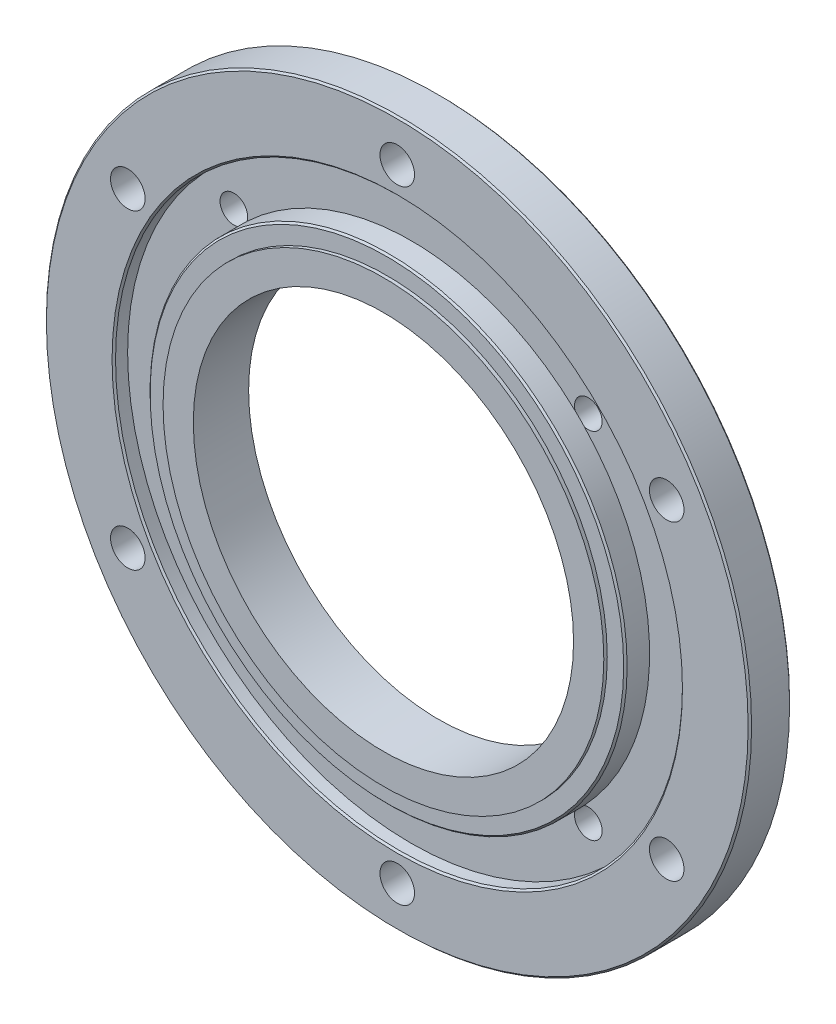
ISO-10303-21;
HEADER;
FILE_DESCRIPTION(('STEP AP214'),'2;1');
FILE_NAME('part.step','',(''),(''),'','','');
FILE_SCHEMA(('AUTOMOTIVE_DESIGN { 1 0 10303 214 1 1 1 1 }'));
ENDSEC;
DATA;
#1=APPLICATION_CONTEXT('core data for automotive mechanical design processes');
#2=APPLICATION_PROTOCOL_DEFINITION('international standard','automotive_design',2000,#1);
#3=PRODUCT_CONTEXT('',#1,'mechanical');
#4=PRODUCT('Part','Part','',(#3));
#5=PRODUCT_RELATED_PRODUCT_CATEGORY('part','',(#4));
#6=PRODUCT_DEFINITION_FORMATION('','',#4);
#7=PRODUCT_DEFINITION_CONTEXT('part definition',#1,'design');
#8=PRODUCT_DEFINITION('design','',#6,#7);
#9=PRODUCT_DEFINITION_SHAPE('','',#8);
#10=(LENGTH_UNIT() NAMED_UNIT(*) SI_UNIT(.MILLI.,.METRE.));
#11=(NAMED_UNIT(*) PLANE_ANGLE_UNIT() SI_UNIT($,.RADIAN.));
#12=(NAMED_UNIT(*) SI_UNIT($,.STERADIAN.) SOLID_ANGLE_UNIT());
#13=UNCERTAINTY_MEASURE_WITH_UNIT(LENGTH_MEASURE(1.E-05),#10,'distance_accuracy_value','');
#14=(GEOMETRIC_REPRESENTATION_CONTEXT(3) GLOBAL_UNCERTAINTY_ASSIGNED_CONTEXT((#13)) GLOBAL_UNIT_ASSIGNED_CONTEXT((#10,
#11,#12)) REPRESENTATION_CONTEXT('',''));
#15=CARTESIAN_POINT('',(0.,0.,0.));
#16=DIRECTION('',(0.,0.,1.));
#17=DIRECTION('',(1.,0.,0.));
#18=AXIS2_PLACEMENT_3D('',#15,#16,#17);
#19=CARTESIAN_POINT('',(0.,0.,7.99999999999995));
#20=DIRECTION('',(0.,0.,1.));
#21=DIRECTION('',(1.,0.,0.));
#22=AXIS2_PLACEMENT_3D('',#19,#20,#21);
#23=PLANE('',#22);
#24=CARTESIAN_POINT('',(51.2652416360242,51.265241636023,8.00000000000006));
#25=DIRECTION('',(0.,0.,-1.));
#26=DIRECTION('',(-1.,0.,0.));
#27=AXIS2_PLACEMENT_3D('',#24,#25,#26);
#28=CIRCLE('',#27,4.00000000000171);
#29=CARTESIAN_POINT('',(47.4363605014642,50.1078008135977,8.0000000000004));
#30=VERTEX_POINT('',#29);
#31=CARTESIAN_POINT('',(50.1078008135984,47.4363605014619,7.99999999999998));
#32=VERTEX_POINT('',#31);
#33=EDGE_CURVE('E87',#30,#32,#28,.T.);
#34=ORIENTED_EDGE('',*,*,#33,.T.);
#35=CARTESIAN_POINT('',(0.,0.,7.99999999999995));
#36=DIRECTION('',(0.,0.,1.));
#37=DIRECTION('',(1.,0.,0.));
#38=AXIS2_PLACEMENT_3D('',#35,#36,#37);
#39=CIRCLE('',#38,69.);
#40=CARTESIAN_POINT('',(50.1078008135947,-47.4363605014665,8.00000000000015));
#41=VERTEX_POINT('',#40);
#42=EDGE_CURVE('E80',#41,#32,#39,.T.);
#43=ORIENTED_EDGE('',*,*,#42,.F.);
#44=CARTESIAN_POINT('',(51.265241636023,-51.2652416360264,8.00000000000042));
#45=DIRECTION('',(0.,0.,-1.));
#46=DIRECTION('',(-1.,0.,0.));
#47=AXIS2_PLACEMENT_3D('',#44,#45,#46);
#48=CIRCLE('',#47,4.00000000000117);
#49=CARTESIAN_POINT('',(47.4363605014638,-50.1078008135977,8.00000000000017));
#50=VERTEX_POINT('',#49);
#51=EDGE_CURVE('E252',#41,#50,#48,.T.);
#52=ORIENTED_EDGE('',*,*,#51,.T.);
#53=CARTESIAN_POINT('',(-47.4363605014694,-50.1078008135922,8.00000000000009));
#54=VERTEX_POINT('',#53);
#55=EDGE_CURVE('E102',#54,#50,#39,.T.);
#56=ORIENTED_EDGE('',*,*,#55,.F.);
#57=CARTESIAN_POINT('',(-51.265241636027,-51.2652416360243,7.99999999999998));
#58=DIRECTION('',(0.,0.,-1.));
#59=DIRECTION('',(-1.,0.,0.));
#60=AXIS2_PLACEMENT_3D('',#57,#58,#59);
#61=CIRCLE('',#60,3.99999999999969);
#62=CARTESIAN_POINT('',(-50.1078008135937,-47.4363605014679,8.00000000000009));
#63=VERTEX_POINT('',#62);
#64=EDGE_CURVE('E248',#54,#63,#61,.T.);
#65=ORIENTED_EDGE('',*,*,#64,.T.);
#66=CARTESIAN_POINT('',(-50.1078008135942,47.4363605014672,8.00000000000009));
#67=VERTEX_POINT('',#66);
#68=EDGE_CURVE('E107',#67,#63,#39,.T.);
#69=ORIENTED_EDGE('',*,*,#68,.F.);
#70=CARTESIAN_POINT('',(-51.2652416360244,51.2652416360249,8.00000000000023));
#71=DIRECTION('',(0.,0.,-1.));
#72=DIRECTION('',(-1.,0.,0.));
#73=AXIS2_PLACEMENT_3D('',#70,#71,#72);
#74=CIRCLE('',#73,4.);
#75=CARTESIAN_POINT('',(-47.4363605014667,50.1078008135947,8.0000000000002));
#76=VERTEX_POINT('',#75);
#77=EDGE_CURVE('E241',#67,#76,#74,.T.);
#78=ORIENTED_EDGE('',*,*,#77,.T.);
#79=EDGE_CURVE('E81',#30,#76,#39,.T.);
#80=ORIENTED_EDGE('',*,*,#79,.F.);
#81=EDGE_LOOP('',(#34,#43,#52,#56,#65,#69,#78,#80));
#82=FACE_BOUND('',#81,.T.);
#83=CARTESIAN_POINT('',(0.,0.,7.99999999999995));
#84=DIRECTION('',(0.,0.,1.));
#85=DIRECTION('',(1.,0.,0.));
#86=AXIS2_PLACEMENT_3D('',#83,#84,#85);
#87=CIRCLE('',#86,82.);
#88=CARTESIAN_POINT('',(82.0000000000001,0.,7.99999999999997));
#89=VERTEX_POINT('',#88);
#90=EDGE_CURVE('E106',#89,#89,#87,.T.);
#91=ORIENTED_EDGE('',*,*,#90,.T.);
#92=EDGE_LOOP('',(#91));
#93=FACE_BOUND('',#92,.T.);
#94=ADVANCED_FACE('F36',(#82,#93),#23,.T.);
#95=CARTESIAN_POINT('',(3.33066907387547E-13,0.,15.0000000000003));
#96=DIRECTION('',(0.,0.,1.));
#97=DIRECTION('',(1.,0.,0.));
#98=AXIS2_PLACEMENT_3D('',#95,#96,#97);
#99=PLANE('',#98);
#100=CARTESIAN_POINT('',(3.33066907387547E-13,0.,15.0000000000003));
#101=DIRECTION('',(0.,0.,1.));
#102=DIRECTION('',(1.,0.,0.));
#103=AXIS2_PLACEMENT_3D('',#100,#101,#102);
#104=CIRCLE('',#103,68.5);
#105=CARTESIAN_POINT('',(68.5000000000004,0.,15.0000000000003));
#106=VERTEX_POINT('',#105);
#107=EDGE_CURVE('E112',#106,#106,#104,.T.);
#108=ORIENTED_EDGE('',*,*,#107,.T.);
#109=EDGE_LOOP('',(#108));
#110=FACE_BOUND('',#109,.T.);
#111=CARTESIAN_POINT('',(3.33066907387547E-13,0.,15.0000000000003));
#112=DIRECTION('',(0.,0.,1.));
#113=DIRECTION('',(1.,0.,0.));
#114=AXIS2_PLACEMENT_3D('',#111,#112,#113);
#115=CIRCLE('',#114,63.75);
#116=CARTESIAN_POINT('',(63.7500000000004,0.,15.0000000000003));
#117=VERTEX_POINT('',#116);
#118=EDGE_CURVE('E108',#117,#117,#115,.T.);
#119=ORIENTED_EDGE('',*,*,#118,.F.);
#120=EDGE_LOOP('',(#119));
#121=FACE_BOUND('',#120,.T.);
#122=ADVANCED_FACE('F151',(#110,#121),#99,.T.);
#123=CARTESIAN_POINT('',(-6.66133814775094E-13,1.11022302462516E-13,12.0000000000002));
#124=DIRECTION('',(0.,0.,1.));
#125=DIRECTION('',(1.,0.,0.));
#126=AXIS2_PLACEMENT_3D('',#123,#124,#125);
#127=PLANE('',#126);
#128=CARTESIAN_POINT('',(77.9422863405983,45.0000000000007,12.0000000000001));
#129=DIRECTION('',(0.,0.,1.));
#130=DIRECTION('',(1.,0.,0.));
#131=AXIS2_PLACEMENT_3D('',#128,#129,#130);
#132=CIRCLE('',#131,5.);
#133=CARTESIAN_POINT('',(82.9422863405983,45.0000000000007,12.0000000000001));
#134=VERTEX_POINT('',#133);
#135=EDGE_CURVE('E228',#134,#134,#132,.T.);
#136=ORIENTED_EDGE('',*,*,#135,.F.);
#137=EDGE_LOOP('',(#136));
#138=FACE_BOUND('',#137,.T.);
#139=CARTESIAN_POINT('',(77.942286340598,-45.0000000000009,12.0000000000003));
#140=DIRECTION('',(0.,0.,1.));
#141=DIRECTION('',(1.,0.,0.));
#142=AXIS2_PLACEMENT_3D('',#139,#140,#141);
#143=CIRCLE('',#142,5.00000000000299);
#144=CARTESIAN_POINT('',(82.942286340601,-45.0000000000009,12.0000000000003));
#145=VERTEX_POINT('',#144);
#146=EDGE_CURVE('E222',#145,#145,#143,.T.);
#147=ORIENTED_EDGE('',*,*,#146,.F.);
#148=EDGE_LOOP('',(#147));
#149=FACE_BOUND('',#148,.T.);
#150=CARTESIAN_POINT('',(-2.4980018054066E-12,-90.0000000000003,12.0000000000001));
#151=DIRECTION('',(0.,0.,1.));
#152=DIRECTION('',(1.,0.,0.));
#153=AXIS2_PLACEMENT_3D('',#150,#151,#152);
#154=CIRCLE('',#153,5.00000000000306);
#155=CARTESIAN_POINT('',(5.00000000000057,-90.0000000000003,12.0000000000002));
#156=VERTEX_POINT('',#155);
#157=EDGE_CURVE('E216',#156,#156,#154,.T.);
#158=ORIENTED_EDGE('',*,*,#157,.F.);
#159=EDGE_LOOP('',(#158));
#160=FACE_BOUND('',#159,.T.);
#161=CARTESIAN_POINT('',(-77.9422863406012,-44.9999999999992,12.0000000000001));
#162=DIRECTION('',(0.,0.,1.));
#163=DIRECTION('',(1.,0.,0.));
#164=AXIS2_PLACEMENT_3D('',#161,#162,#163);
#165=CIRCLE('',#164,5.00000000000191);
#166=CARTESIAN_POINT('',(-72.9422863405993,-44.9999999999992,12.0000000000001));
#167=VERTEX_POINT('',#166);
#168=EDGE_CURVE('E210',#167,#167,#165,.T.);
#169=ORIENTED_EDGE('',*,*,#168,.F.);
#170=EDGE_LOOP('',(#169));
#171=FACE_BOUND('',#170,.T.);
#172=CARTESIAN_POINT('',(-77.9422863406001,44.9999999999999,12.));
#173=DIRECTION('',(0.,0.,1.));
#174=DIRECTION('',(1.,0.,0.));
#175=AXIS2_PLACEMENT_3D('',#172,#173,#174);
#176=CIRCLE('',#175,5.00000000000002);
#177=CARTESIAN_POINT('',(-72.9422863406001,44.9999999999999,12.));
#178=VERTEX_POINT('',#177);
#179=EDGE_CURVE('E202',#178,#178,#176,.T.);
#180=ORIENTED_EDGE('',*,*,#179,.F.);
#181=EDGE_LOOP('',(#180));
#182=FACE_BOUND('',#181,.T.);
#183=CARTESIAN_POINT('',(-4.44089209850063E-13,90.0000000000001,11.9999999999997));
#184=DIRECTION('',(0.,0.,1.));
#185=DIRECTION('',(1.,0.,0.));
#186=AXIS2_PLACEMENT_3D('',#183,#184,#185);
#187=CIRCLE('',#186,5.);
#188=CARTESIAN_POINT('',(4.99999999999957,90.0000000000001,11.9999999999997));
#189=VERTEX_POINT('',#188);
#190=EDGE_CURVE('E194',#189,#189,#187,.T.);
#191=ORIENTED_EDGE('',*,*,#190,.F.);
#192=EDGE_LOOP('',(#191));
#193=FACE_BOUND('',#192,.T.);
#194=CARTESIAN_POINT('',(-6.66133814775094E-13,1.11022302462516E-13,12.0000000000002));
#195=DIRECTION('',(0.,0.,1.));
#196=DIRECTION('',(1.,0.,0.));
#197=AXIS2_PLACEMENT_3D('',#194,#195,#196);
#198=CIRCLE('',#197,82.5);
#199=CARTESIAN_POINT('',(82.4999999999994,0.,12.0000000000003));
#200=VERTEX_POINT('',#199);
#201=EDGE_CURVE('E124',#200,#200,#198,.F.);
#202=ORIENTED_EDGE('',*,*,#201,.T.);
#203=EDGE_LOOP('',(#202));
#204=FACE_BOUND('',#203,.T.);
#205=CARTESIAN_POINT('',(-6.66133814775094E-13,1.11022302462516E-13,12.0000000000002));
#206=DIRECTION('',(0.,0.,1.));
#207=DIRECTION('',(1.,0.,0.));
#208=AXIS2_PLACEMENT_3D('',#205,#206,#207);
#209=CIRCLE('',#208,101.5);
#210=CARTESIAN_POINT('',(101.499999999999,0.,12.0000000000003));
#211=VERTEX_POINT('',#210);
#212=EDGE_CURVE('E121',#211,#211,#209,.T.);
#213=ORIENTED_EDGE('',*,*,#212,.T.);
#214=EDGE_LOOP('',(#213));
#215=FACE_BOUND('',#214,.T.);
#216=ADVANCED_FACE('F156',(#138,#149,#160,#171,#182,#193,#204,#215),#127,.T.);
#217=CARTESIAN_POINT('',(-6.66133814775094E-13,1.11022302462516E-13,12.0000000000002));
#218=DIRECTION('',(0.,0.,-1.));
#219=DIRECTION('',(-1.,0.,0.));
#220=AXIS2_PLACEMENT_3D('',#217,#218,#219);
#221=CYLINDRICAL_SURFACE('',#220,102.);
#222=CARTESIAN_POINT('',(3.33066907387547E-13,0.,0.499999999999862));
#223=DIRECTION('',(0.,0.,1.));
#224=DIRECTION('',(1.,0.,0.));
#225=AXIS2_PLACEMENT_3D('',#222,#223,#224);
#226=CIRCLE('',#225,102.);
#227=CARTESIAN_POINT('',(102.,0.,0.499999999999886));
#228=VERTEX_POINT('',#227);
#229=EDGE_CURVE('E45',#228,#228,#226,.T.);
#230=ORIENTED_EDGE('',*,*,#229,.T.);
#231=EDGE_LOOP('',(#230));
#232=FACE_BOUND('',#231,.T.);
#233=CARTESIAN_POINT('',(3.33066907387547E-13,0.,11.4999999999998));
#234=DIRECTION('',(0.,0.,1.));
#235=DIRECTION('',(1.,0.,0.));
#236=AXIS2_PLACEMENT_3D('',#233,#234,#235);
#237=CIRCLE('',#236,102.);
#238=CARTESIAN_POINT('',(102.,0.,11.4999999999999));
#239=VERTEX_POINT('',#238);
#240=EDGE_CURVE('E127',#239,#239,#237,.F.);
#241=ORIENTED_EDGE('',*,*,#240,.T.);
#242=EDGE_LOOP('',(#241));
#243=FACE_BOUND('',#242,.T.);
#244=ADVANCED_FACE('F133',(#232,#243),#221,.T.);
#245=CARTESIAN_POINT('',(-7.7715611723761E-13,1.11022302462516E-13,0.));
#246=DIRECTION('',(0.,0.,1.));
#247=DIRECTION('',(1.,0.,0.));
#248=AXIS2_PLACEMENT_3D('',#245,#246,#247);
#249=PLANE('',#248);
#250=CARTESIAN_POINT('',(51.2652416360243,51.2652416360231,-3.33066907387547E-13));
#251=DIRECTION('',(0.,0.,-1.));
#252=DIRECTION('',(-1.,0.,0.));
#253=AXIS2_PLACEMENT_3D('',#250,#251,#252);
#254=CIRCLE('',#253,4.00000000000171);
#255=CARTESIAN_POINT('',(47.2652416360226,51.2652416360231,-3.33774674565746E-13));
#256=VERTEX_POINT('',#255);
#257=EDGE_CURVE('E97',#256,#256,#254,.T.);
#258=ORIENTED_EDGE('',*,*,#257,.F.);
#259=EDGE_LOOP('',(#258));
#260=FACE_BOUND('',#259,.T.);
#261=CARTESIAN_POINT('',(51.2652416360236,-51.2652416360263,2.22044604925031E-13));
#262=DIRECTION('',(0.,0.,-1.));
#263=DIRECTION('',(-1.,0.,0.));
#264=AXIS2_PLACEMENT_3D('',#261,#262,#263);
#265=CIRCLE('',#264,4.00000000000117);
#266=CARTESIAN_POINT('',(47.2652416360225,-51.2652416360263,2.21336837746833E-13));
#267=VERTEX_POINT('',#266);
#268=EDGE_CURVE('E89',#267,#267,#265,.T.);
#269=ORIENTED_EDGE('',*,*,#268,.F.);
#270=EDGE_LOOP('',(#269));
#271=FACE_BOUND('',#270,.T.);
#272=CARTESIAN_POINT('',(-51.265241636026,-51.2652416360249,-3.05311331771918E-13));
#273=DIRECTION('',(0.,0.,-1.));
#274=DIRECTION('',(-1.,0.,0.));
#275=AXIS2_PLACEMENT_3D('',#272,#273,#274);
#276=CIRCLE('',#275,3.99999999999969);
#277=CARTESIAN_POINT('',(-55.2652416360257,-51.2652416360249,-3.06019098950117E-13));
#278=VERTEX_POINT('',#277);
#279=EDGE_CURVE('E245',#278,#278,#276,.T.);
#280=ORIENTED_EDGE('',*,*,#279,.F.);
#281=EDGE_LOOP('',(#280));
#282=FACE_BOUND('',#281,.T.);
#283=CARTESIAN_POINT('',(-51.2652416360249,51.2652416360246,0.));
#284=DIRECTION('',(0.,0.,-1.));
#285=DIRECTION('',(-1.,0.,0.));
#286=AXIS2_PLACEMENT_3D('',#283,#284,#285);
#287=CIRCLE('',#286,4.);
#288=CARTESIAN_POINT('',(-55.2652416360249,51.2652416360246,0.));
#289=VERTEX_POINT('',#288);
#290=EDGE_CURVE('E238',#289,#289,#287,.T.);
#291=ORIENTED_EDGE('',*,*,#290,.F.);
#292=EDGE_LOOP('',(#291));
#293=FACE_BOUND('',#292,.T.);
#294=CARTESIAN_POINT('',(-7.7715611723761E-13,1.11022302462516E-13,0.));
#295=DIRECTION('',(0.,0.,-1.));
#296=DIRECTION('',(-1.,0.,0.));
#297=AXIS2_PLACEMENT_3D('',#294,#295,#296);
#298=CIRCLE('',#297,55.);
#299=CARTESIAN_POINT('',(-55.0000000000009,1.3239409568655E-13,0.));
#300=VERTEX_POINT('',#299);
#301=EDGE_CURVE('E234',#300,#300,#298,.T.);
#302=ORIENTED_EDGE('',*,*,#301,.F.);
#303=EDGE_LOOP('',(#302));
#304=FACE_BOUND('',#303,.T.);
#305=CARTESIAN_POINT('',(77.9422863405989,45.0000000000009,0.));
#306=DIRECTION('',(0.,0.,-1.));
#307=DIRECTION('',(-1.,0.,0.));
#308=AXIS2_PLACEMENT_3D('',#305,#306,#307);
#309=CIRCLE('',#308,5.);
#310=CARTESIAN_POINT('',(72.9422863405989,45.0000000000009,0.));
#311=VERTEX_POINT('',#310);
#312=EDGE_CURVE('E231',#311,#311,#309,.T.);
#313=ORIENTED_EDGE('',*,*,#312,.F.);
#314=EDGE_LOOP('',(#313));
#315=FACE_BOUND('',#314,.T.);
#316=CARTESIAN_POINT('',(77.9422863405976,-45.0000000000013,2.22044604925031E-13));
#317=DIRECTION('',(0.,0.,-1.));
#318=DIRECTION('',(-1.,0.,0.));
#319=AXIS2_PLACEMENT_3D('',#316,#317,#318);
#320=CIRCLE('',#319,5.00000000000299);
#321=CARTESIAN_POINT('',(72.9422863405946,-45.0000000000013,2.20830298491847E-13));
#322=VERTEX_POINT('',#321);
#323=EDGE_CURVE('E225',#322,#322,#320,.T.);
#324=ORIENTED_EDGE('',*,*,#323,.F.);
#325=EDGE_LOOP('',(#324));
#326=FACE_BOUND('',#325,.T.);
#327=CARTESIAN_POINT('',(-2.66453525910038E-12,-90.0000000000003,3.33066907387547E-13));
#328=DIRECTION('',(0.,0.,-1.));
#329=DIRECTION('',(-1.,0.,0.));
#330=AXIS2_PLACEMENT_3D('',#327,#328,#329);
#331=CIRCLE('',#330,5.00000000000306);
#332=CARTESIAN_POINT('',(-5.00000000000573,-90.0000000000003,3.31852600954362E-13));
#333=VERTEX_POINT('',#332);
#334=EDGE_CURVE('E219',#333,#333,#331,.T.);
#335=ORIENTED_EDGE('',*,*,#334,.F.);
#336=EDGE_LOOP('',(#335));
#337=FACE_BOUND('',#336,.T.);
#338=CARTESIAN_POINT('',(-77.942286340602,-44.9999999999992,0.));
#339=DIRECTION('',(0.,0.,-1.));
#340=DIRECTION('',(-1.,0.,0.));
#341=AXIS2_PLACEMENT_3D('',#338,#339,#340);
#342=CIRCLE('',#341,5.00000000000191);
#343=CARTESIAN_POINT('',(-82.9422863406039,-44.9999999999992,0.));
#344=VERTEX_POINT('',#343);
#345=EDGE_CURVE('E213',#344,#344,#342,.T.);
#346=ORIENTED_EDGE('',*,*,#345,.F.);
#347=EDGE_LOOP('',(#346));
#348=FACE_BOUND('',#347,.T.);
#349=CARTESIAN_POINT('',(-77.9422863405996,45.0000000000001,0.));
#350=DIRECTION('',(0.,0.,-1.));
#351=DIRECTION('',(-1.,0.,0.));
#352=AXIS2_PLACEMENT_3D('',#349,#350,#351);
#353=CIRCLE('',#352,5.00000000000002);
#354=CARTESIAN_POINT('',(-82.9422863405997,45.0000000000001,0.));
#355=VERTEX_POINT('',#354);
#356=EDGE_CURVE('E207',#355,#355,#353,.T.);
#357=ORIENTED_EDGE('',*,*,#356,.F.);
#358=EDGE_LOOP('',(#357));
#359=FACE_BOUND('',#358,.T.);
#360=CARTESIAN_POINT('',(0.,90.0000000000001,1.94289029309402E-13));
#361=DIRECTION('',(0.,0.,-1.));
#362=DIRECTION('',(-1.,0.,0.));
#363=AXIS2_PLACEMENT_3D('',#360,#361,#362);
#364=CIRCLE('',#363,5.);
#365=CARTESIAN_POINT('',(-4.99999999999995,90.0000000000001,1.93074722876219E-13));
#366=VERTEX_POINT('',#365);
#367=EDGE_CURVE('E197',#366,#366,#364,.T.);
#368=ORIENTED_EDGE('',*,*,#367,.F.);
#369=EDGE_LOOP('',(#368));
#370=FACE_BOUND('',#369,.T.);
#371=CARTESIAN_POINT('',(-7.7715611723761E-13,1.11022302462516E-13,0.));
#372=DIRECTION('',(0.,0.,1.));
#373=DIRECTION('',(1.,0.,0.));
#374=AXIS2_PLACEMENT_3D('',#371,#372,#373);
#375=CIRCLE('',#374,101.5);
#376=CARTESIAN_POINT('',(101.499999999999,0.,0.));
#377=VERTEX_POINT('',#376);
#378=EDGE_CURVE('E11',#377,#377,#375,.F.);
#379=ORIENTED_EDGE('',*,*,#378,.T.);
#380=EDGE_LOOP('',(#379));
#381=FACE_BOUND('',#380,.T.);
#382=ADVANCED_FACE('F165',(#260,#271,#282,#293,#304,#315,#326,#337,#348,#359,#370,#381),#249,.F.);
#383=CARTESIAN_POINT('',(0.,0.,7.99999999999995));
#384=DIRECTION('',(0.,0.,1.));
#385=DIRECTION('',(1.,0.,0.));
#386=AXIS2_PLACEMENT_3D('',#383,#384,#385);
#387=CYLINDRICAL_SURFACE('',#386,82.);
#388=CARTESIAN_POINT('',(3.33066907387547E-13,0.,11.4999999999998));
#389=DIRECTION('',(0.,0.,1.));
#390=DIRECTION('',(1.,0.,0.));
#391=AXIS2_PLACEMENT_3D('',#388,#389,#390);
#392=CIRCLE('',#391,82.);
#393=CARTESIAN_POINT('',(82.0000000000005,0.,11.4999999999999));
#394=VERTEX_POINT('',#393);
#395=EDGE_CURVE('E118',#394,#394,#392,.T.);
#396=ORIENTED_EDGE('',*,*,#395,.T.);
#397=EDGE_LOOP('',(#396));
#398=FACE_BOUND('',#397,.T.);
#399=ORIENTED_EDGE('',*,*,#90,.F.);
#400=EDGE_LOOP('',(#399));
#401=FACE_BOUND('',#400,.T.);
#402=ADVANCED_FACE('F163',(#398,#401),#387,.F.);
#403=CARTESIAN_POINT('',(3.33066907387547E-13,0.,15.0000000000003));
#404=DIRECTION('',(0.,0.,-1.));
#405=DIRECTION('',(-1.,0.,0.));
#406=AXIS2_PLACEMENT_3D('',#403,#404,#405);
#407=CYLINDRICAL_SURFACE('',#406,69.);
#408=CARTESIAN_POINT('',(3.33066907387547E-13,0.,14.5));
#409=DIRECTION('',(0.,0.,1.));
#410=DIRECTION('',(1.,0.,0.));
#411=AXIS2_PLACEMENT_3D('',#408,#409,#410);
#412=CIRCLE('',#411,69.);
#413=CARTESIAN_POINT('',(69.0000000000004,0.,14.5));
#414=VERTEX_POINT('',#413);
#415=EDGE_CURVE('E115',#414,#414,#412,.F.);
#416=ORIENTED_EDGE('',*,*,#415,.T.);
#417=EDGE_LOOP('',(#416));
#418=FACE_BOUND('',#417,.T.);
#419=EDGE_CURVE('E103',#76,#67,#39,.T.);
#420=ORIENTED_EDGE('',*,*,#419,.T.);
#421=ORIENTED_EDGE('',*,*,#68,.T.);
#422=EDGE_CURVE('E519',#63,#54,#39,.T.);
#423=ORIENTED_EDGE('',*,*,#422,.T.);
#424=ORIENTED_EDGE('',*,*,#55,.T.);
#425=EDGE_CURVE('E101',#50,#41,#39,.T.);
#426=ORIENTED_EDGE('',*,*,#425,.T.);
#427=ORIENTED_EDGE('',*,*,#42,.T.);
#428=EDGE_CURVE('E76',#32,#30,#39,.T.);
#429=ORIENTED_EDGE('',*,*,#428,.T.);
#430=ORIENTED_EDGE('',*,*,#79,.T.);
#431=EDGE_LOOP('',(#420,#421,#423,#424,#426,#427,#429,#430));
#432=FACE_BOUND('',#431,.T.);
#433=ADVANCED_FACE('F99',(#418,#432),#407,.T.);
#434=CARTESIAN_POINT('',(-2.77555756156289E-13,-2.22044604925031E-13,16.0000000000004));
#435=DIRECTION('',(0.,0.,-1.));
#436=DIRECTION('',(-1.,0.,0.));
#437=AXIS2_PLACEMENT_3D('',#434,#435,#436);
#438=CYLINDRICAL_SURFACE('',#437,63.75);
#439=CARTESIAN_POINT('',(-2.77555756156289E-13,-2.22044604925031E-13,16.0000000000004));
#440=DIRECTION('',(0.,0.,1.));
#441=DIRECTION('',(1.,0.,0.));
#442=AXIS2_PLACEMENT_3D('',#439,#440,#441);
#443=CIRCLE('',#442,63.75);
#444=CARTESIAN_POINT('',(63.7499999999998,-2.4681645616198E-13,16.0000000000004));
#445=VERTEX_POINT('',#444);
#446=EDGE_CURVE('E193',#445,#445,#443,.T.);
#447=ORIENTED_EDGE('',*,*,#446,.F.);
#448=EDGE_LOOP('',(#447));
#449=FACE_BOUND('',#448,.T.);
#450=ORIENTED_EDGE('',*,*,#118,.T.);
#451=EDGE_LOOP('',(#450));
#452=FACE_BOUND('',#451,.T.);
#453=ADVANCED_FACE('F161',(#449,#452),#438,.T.);
#454=CARTESIAN_POINT('',(-2.77555756156289E-13,-2.22044604925031E-13,16.0000000000004));
#455=DIRECTION('',(0.,0.,1.));
#456=DIRECTION('',(1.,0.,0.));
#457=AXIS2_PLACEMENT_3D('',#454,#455,#456);
#458=PLANE('',#457);
#459=CARTESIAN_POINT('',(-2.77555756156289E-13,-2.22044604925031E-13,16.0000000000004));
#460=DIRECTION('',(0.,0.,1.));
#461=DIRECTION('',(1.,0.,0.));
#462=AXIS2_PLACEMENT_3D('',#459,#460,#461);
#463=CIRCLE('',#462,55.);
#464=CARTESIAN_POINT('',(54.9999999999998,-2.43416398149066E-13,16.0000000000004));
#465=VERTEX_POINT('',#464);
#466=EDGE_CURVE('E40',#465,#465,#463,.T.);
#467=ORIENTED_EDGE('',*,*,#466,.F.);
#468=EDGE_LOOP('',(#467));
#469=FACE_BOUND('',#468,.T.);
#470=ORIENTED_EDGE('',*,*,#446,.T.);
#471=EDGE_LOOP('',(#470));
#472=FACE_BOUND('',#471,.T.);
#473=ADVANCED_FACE('F180',(#469,#472),#458,.T.);
#474=CARTESIAN_POINT('',(3.33066907387547E-13,0.,15.0000000000003));
#475=DIRECTION('',(0.,0.,-1.));
#476=DIRECTION('',(-1.,0.,0.));
#477=AXIS2_PLACEMENT_3D('',#474,#475,#476);
#478=CONICAL_SURFACE('',#477,68.5,0.785398163397421);
#479=ORIENTED_EDGE('',*,*,#415,.F.);
#480=EDGE_LOOP('',(#479));
#481=FACE_BOUND('',#480,.T.);
#482=ORIENTED_EDGE('',*,*,#107,.F.);
#483=EDGE_LOOP('',(#482));
#484=FACE_BOUND('',#483,.T.);
#485=ADVANCED_FACE('F146',(#481,#484),#478,.T.);
#486=CARTESIAN_POINT('',(3.33066907387547E-13,0.,11.4999999999998));
#487=DIRECTION('',(0.,0.,1.));
#488=DIRECTION('',(1.,0.,0.));
#489=AXIS2_PLACEMENT_3D('',#486,#487,#488);
#490=CONICAL_SURFACE('',#489,82.,0.785398163397448);
#491=ORIENTED_EDGE('',*,*,#201,.F.);
#492=EDGE_LOOP('',(#491));
#493=FACE_BOUND('',#492,.T.);
#494=ORIENTED_EDGE('',*,*,#395,.F.);
#495=EDGE_LOOP('',(#494));
#496=FACE_BOUND('',#495,.T.);
#497=ADVANCED_FACE('F138',(#493,#496),#490,.F.);
#498=CARTESIAN_POINT('',(3.33066907387547E-13,0.,0.499999999999862));
#499=DIRECTION('',(0.,0.,1.));
#500=DIRECTION('',(1.,0.,0.));
#501=AXIS2_PLACEMENT_3D('',#498,#499,#500);
#502=CONICAL_SURFACE('',#501,102.,0.785398163397462);
#503=ORIENTED_EDGE('',*,*,#378,.F.);
#504=EDGE_LOOP('',(#503));
#505=FACE_BOUND('',#504,.T.);
#506=ORIENTED_EDGE('',*,*,#229,.F.);
#507=EDGE_LOOP('',(#506));
#508=FACE_BOUND('',#507,.T.);
#509=ADVANCED_FACE('F136',(#505,#508),#502,.T.);
#510=CARTESIAN_POINT('',(-6.66133814775094E-13,1.11022302462516E-13,12.0000000000002));
#511=DIRECTION('',(0.,0.,-1.));
#512=DIRECTION('',(-1.,0.,0.));
#513=AXIS2_PLACEMENT_3D('',#510,#511,#512);
#514=CONICAL_SURFACE('',#513,101.5,0.785398163397421);
#515=ORIENTED_EDGE('',*,*,#240,.F.);
#516=EDGE_LOOP('',(#515));
#517=FACE_BOUND('',#516,.T.);
#518=ORIENTED_EDGE('',*,*,#212,.F.);
#519=EDGE_LOOP('',(#518));
#520=FACE_BOUND('',#519,.T.);
#521=ADVANCED_FACE('F38',(#517,#520),#514,.T.);
#522=CARTESIAN_POINT('',(0.,89.9999999999999,41.0000000000001));
#523=DIRECTION('',(0.,0.,-1.));
#524=DIRECTION('',(-1.,0.,0.));
#525=AXIS2_PLACEMENT_3D('',#522,#523,#524);
#526=CYLINDRICAL_SURFACE('',#525,5.);
#527=ORIENTED_EDGE('',*,*,#190,.T.);
#528=EDGE_LOOP('',(#527));
#529=FACE_BOUND('',#528,.T.);
#530=ORIENTED_EDGE('',*,*,#367,.T.);
#531=EDGE_LOOP('',(#530));
#532=FACE_BOUND('',#531,.T.);
#533=ADVANCED_FACE('F144',(#529,#532),#526,.F.);
#534=CARTESIAN_POINT('',(-77.9422863405992,44.9999999999998,41.0000000000001));
#535=DIRECTION('',(0.,0.,-1.));
#536=DIRECTION('',(-1.,0.,0.));
#537=AXIS2_PLACEMENT_3D('',#534,#535,#536);
#538=CYLINDRICAL_SURFACE('',#537,5.00000000000002);
#539=ORIENTED_EDGE('',*,*,#179,.T.);
#540=EDGE_LOOP('',(#539));
#541=FACE_BOUND('',#540,.T.);
#542=ORIENTED_EDGE('',*,*,#356,.T.);
#543=EDGE_LOOP('',(#542));
#544=FACE_BOUND('',#543,.T.);
#545=ADVANCED_FACE('F279',(#541,#544),#538,.F.);
#546=CARTESIAN_POINT('',(-77.9422863406016,-44.9999999999989,41.));
#547=DIRECTION('',(0.,0.,-1.));
#548=DIRECTION('',(-1.,0.,0.));
#549=AXIS2_PLACEMENT_3D('',#546,#547,#548);
#550=CYLINDRICAL_SURFACE('',#549,5.00000000000191);
#551=ORIENTED_EDGE('',*,*,#168,.T.);
#552=EDGE_LOOP('',(#551));
#553=FACE_BOUND('',#552,.T.);
#554=ORIENTED_EDGE('',*,*,#345,.T.);
#555=EDGE_LOOP('',(#554));
#556=FACE_BOUND('',#555,.T.);
#557=ADVANCED_FACE('F284',(#553,#556),#550,.F.);
#558=CARTESIAN_POINT('',(-2.44249065417534E-12,-90.0000000000003,41.0000000000001));
#559=DIRECTION('',(0.,0.,-1.));
#560=DIRECTION('',(-1.,0.,0.));
#561=AXIS2_PLACEMENT_3D('',#558,#559,#560);
#562=CYLINDRICAL_SURFACE('',#561,5.00000000000306);
#563=ORIENTED_EDGE('',*,*,#157,.T.);
#564=EDGE_LOOP('',(#563));
#565=FACE_BOUND('',#564,.T.);
#566=ORIENTED_EDGE('',*,*,#334,.T.);
#567=EDGE_LOOP('',(#566));
#568=FACE_BOUND('',#567,.T.);
#569=ADVANCED_FACE('F290',(#565,#568),#562,.F.);
#570=CARTESIAN_POINT('',(77.9422863405977,-45.0000000000013,41.0000000000002));
#571=DIRECTION('',(0.,0.,-1.));
#572=DIRECTION('',(-1.,0.,0.));
#573=AXIS2_PLACEMENT_3D('',#570,#571,#572);
#574=CYLINDRICAL_SURFACE('',#573,5.00000000000299);
#575=ORIENTED_EDGE('',*,*,#146,.T.);
#576=EDGE_LOOP('',(#575));
#577=FACE_BOUND('',#576,.T.);
#578=ORIENTED_EDGE('',*,*,#323,.T.);
#579=EDGE_LOOP('',(#578));
#580=FACE_BOUND('',#579,.T.);
#581=ADVANCED_FACE('F294',(#577,#580),#574,.F.);
#582=CARTESIAN_POINT('',(77.9422863405987,45.000000000001,41.0000000000001));
#583=DIRECTION('',(0.,0.,-1.));
#584=DIRECTION('',(-1.,0.,0.));
#585=AXIS2_PLACEMENT_3D('',#582,#583,#584);
#586=CYLINDRICAL_SURFACE('',#585,5.);
#587=ORIENTED_EDGE('',*,*,#135,.T.);
#588=EDGE_LOOP('',(#587));
#589=FACE_BOUND('',#588,.T.);
#590=ORIENTED_EDGE('',*,*,#312,.T.);
#591=EDGE_LOOP('',(#590));
#592=FACE_BOUND('',#591,.T.);
#593=ADVANCED_FACE('F298',(#589,#592),#586,.F.);
#594=CARTESIAN_POINT('',(-4.44089209850063E-13,0.,51.0000000000002));
#595=DIRECTION('',(0.,0.,-1.));
#596=DIRECTION('',(-1.,0.,0.));
#597=AXIS2_PLACEMENT_3D('',#594,#595,#596);
#598=CYLINDRICAL_SURFACE('',#597,55.);
#599=ORIENTED_EDGE('',*,*,#466,.T.);
#600=EDGE_LOOP('',(#599));
#601=FACE_BOUND('',#600,.T.);
#602=ORIENTED_EDGE('',*,*,#301,.T.);
#603=EDGE_LOOP('',(#602));
#604=FACE_BOUND('',#603,.T.);
#605=ADVANCED_FACE('F302',(#601,#604),#598,.F.);
#606=CARTESIAN_POINT('',(-51.2652416360244,51.2652416360249,8.00000000000023));
#607=DIRECTION('',(0.,0.,-1.));
#608=DIRECTION('',(-1.,0.,0.));
#609=AXIS2_PLACEMENT_3D('',#606,#607,#608);
#610=CYLINDRICAL_SURFACE('',#609,4.);
#611=EDGE_CURVE('E237',#76,#67,#74,.T.);
#612=ORIENTED_EDGE('',*,*,#611,.F.);
#613=ORIENTED_EDGE('',*,*,#77,.F.);
#614=EDGE_LOOP('',(#612,#613));
#615=FACE_BOUND('',#614,.T.);
#616=ORIENTED_EDGE('',*,*,#290,.T.);
#617=EDGE_LOOP('',(#616));
#618=FACE_BOUND('',#617,.T.);
#619=ADVANCED_FACE('F306',(#615,#618),#610,.F.);
#620=CARTESIAN_POINT('',(-51.2652416360244,51.2652416360249,8.00000000000023));
#621=DIRECTION('',(0.,0.,-1.));
#622=DIRECTION('',(-1.,0.,0.));
#623=AXIS2_PLACEMENT_3D('',#620,#621,#622);
#624=PLANE('',#623);
#625=ORIENTED_EDGE('',*,*,#611,.T.);
#626=ORIENTED_EDGE('',*,*,#419,.F.);
#627=EDGE_LOOP('',(#625,#626));
#628=FACE_BOUND('',#627,.T.);
#629=ADVANCED_FACE('F310',(#628),#624,.T.);
#630=CARTESIAN_POINT('',(-51.265241636027,-51.2652416360243,7.99999999999998));
#631=DIRECTION('',(0.,0.,-1.));
#632=DIRECTION('',(-1.,0.,0.));
#633=AXIS2_PLACEMENT_3D('',#630,#631,#632);
#634=PLANE('',#633);
#635=ORIENTED_EDGE('',*,*,#422,.F.);
#636=EDGE_CURVE('E242',#63,#54,#61,.T.);
#637=ORIENTED_EDGE('',*,*,#636,.T.);
#638=EDGE_LOOP('',(#635,#637));
#639=FACE_BOUND('',#638,.T.);
#640=ADVANCED_FACE('F314',(#639),#634,.T.);
#641=CARTESIAN_POINT('',(-51.265241636027,-51.2652416360243,7.99999999999998));
#642=DIRECTION('',(0.,0.,-1.));
#643=DIRECTION('',(-1.,0.,0.));
#644=AXIS2_PLACEMENT_3D('',#641,#642,#643);
#645=CYLINDRICAL_SURFACE('',#644,3.99999999999969);
#646=ORIENTED_EDGE('',*,*,#636,.F.);
#647=ORIENTED_EDGE('',*,*,#64,.F.);
#648=EDGE_LOOP('',(#646,#647));
#649=FACE_BOUND('',#648,.T.);
#650=ORIENTED_EDGE('',*,*,#279,.T.);
#651=EDGE_LOOP('',(#650));
#652=FACE_BOUND('',#651,.T.);
#653=ADVANCED_FACE('F316',(#649,#652),#645,.F.);
#654=CARTESIAN_POINT('',(51.265241636023,-51.2652416360264,8.00000000000042));
#655=DIRECTION('',(0.,0.,-1.));
#656=DIRECTION('',(-1.,0.,0.));
#657=AXIS2_PLACEMENT_3D('',#654,#655,#656);
#658=PLANE('',#657);
#659=ORIENTED_EDGE('',*,*,#425,.F.);
#660=EDGE_CURVE('E58',#50,#41,#48,.T.);
#661=ORIENTED_EDGE('',*,*,#660,.T.);
#662=EDGE_LOOP('',(#659,#661));
#663=FACE_BOUND('',#662,.T.);
#664=ADVANCED_FACE('F319',(#663),#658,.T.);
#665=CARTESIAN_POINT('',(51.265241636023,-51.2652416360264,8.00000000000042));
#666=DIRECTION('',(0.,0.,-1.));
#667=DIRECTION('',(-1.,0.,0.));
#668=AXIS2_PLACEMENT_3D('',#665,#666,#667);
#669=CYLINDRICAL_SURFACE('',#668,4.00000000000117);
#670=ORIENTED_EDGE('',*,*,#660,.F.);
#671=ORIENTED_EDGE('',*,*,#51,.F.);
#672=EDGE_LOOP('',(#670,#671));
#673=FACE_BOUND('',#672,.T.);
#674=ORIENTED_EDGE('',*,*,#268,.T.);
#675=EDGE_LOOP('',(#674));
#676=FACE_BOUND('',#675,.T.);
#677=ADVANCED_FACE('F324',(#673,#676),#669,.F.);
#678=CARTESIAN_POINT('',(51.2652416360242,51.265241636023,8.00000000000006));
#679=DIRECTION('',(0.,0.,-1.));
#680=DIRECTION('',(-1.,0.,0.));
#681=AXIS2_PLACEMENT_3D('',#678,#679,#680);
#682=PLANE('',#681);
#683=ORIENTED_EDGE('',*,*,#428,.F.);
#684=EDGE_CURVE('E51',#32,#30,#28,.T.);
#685=ORIENTED_EDGE('',*,*,#684,.T.);
#686=EDGE_LOOP('',(#683,#685));
#687=FACE_BOUND('',#686,.T.);
#688=ADVANCED_FACE('F77',(#687),#682,.T.);
#689=CARTESIAN_POINT('',(51.2652416360242,51.265241636023,8.00000000000006));
#690=DIRECTION('',(0.,0.,-1.));
#691=DIRECTION('',(-1.,0.,0.));
#692=AXIS2_PLACEMENT_3D('',#689,#690,#691);
#693=CYLINDRICAL_SURFACE('',#692,4.00000000000171);
#694=ORIENTED_EDGE('',*,*,#684,.F.);
#695=ORIENTED_EDGE('',*,*,#33,.F.);
#696=EDGE_LOOP('',(#694,#695));
#697=FACE_BOUND('',#696,.T.);
#698=ORIENTED_EDGE('',*,*,#257,.T.);
#699=EDGE_LOOP('',(#698));
#700=FACE_BOUND('',#699,.T.);
#701=ADVANCED_FACE('F85',(#697,#700),#693,.F.);
#702=CLOSED_SHELL('',(#94,#122,#216,#244,#382,#402,#433,#453,#473,#485,#497,#509,#521,#533,#545,
#557,#569,#581,#593,#605,#619,#629,#640,#653,#664,#677,#688,#701));
#703=MANIFOLD_SOLID_BREP('B2',#702);
#704=ADVANCED_BREP_SHAPE_REPRESENTATION('',(#18,#703),#14);
#705=SHAPE_DEFINITION_REPRESENTATION(#9,#704);
ENDSEC;
END-ISO-10303-21;
